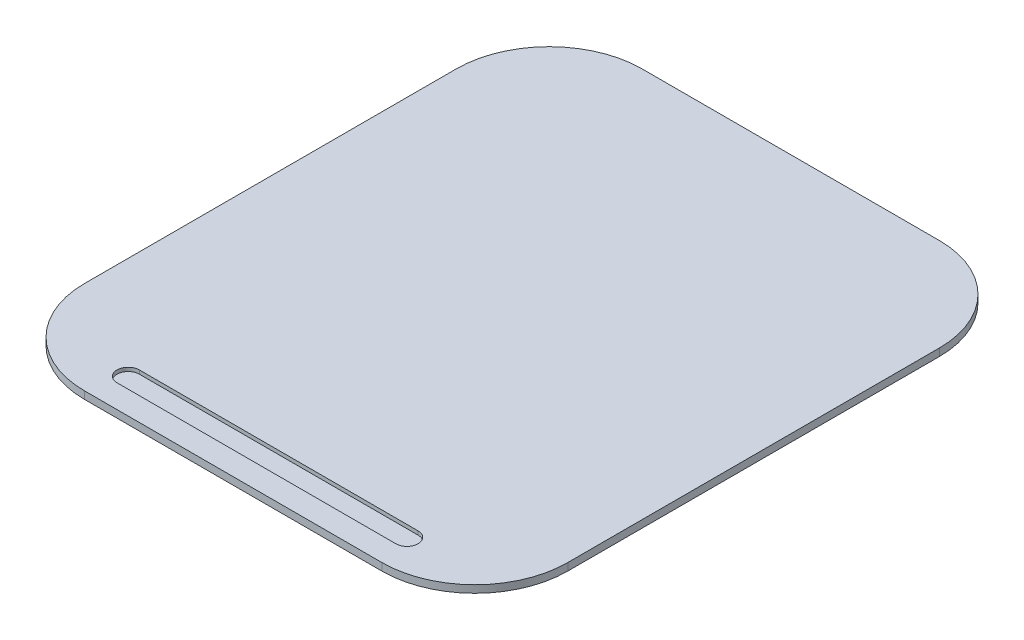
ISO-10303-21;
HEADER;
FILE_DESCRIPTION(('STEP AP214'),'2;1');
FILE_NAME('part.step','',(''),(''),'','','');
FILE_SCHEMA(('AUTOMOTIVE_DESIGN { 1 0 10303 214 1 1 1 1 }'));
ENDSEC;
DATA;
#1=APPLICATION_CONTEXT('core data for automotive mechanical design processes');
#2=APPLICATION_PROTOCOL_DEFINITION('international standard','automotive_design',2000,#1);
#3=PRODUCT_CONTEXT('',#1,'mechanical');
#4=PRODUCT('Part','Part','',(#3));
#5=PRODUCT_RELATED_PRODUCT_CATEGORY('part','',(#4));
#6=PRODUCT_DEFINITION_FORMATION('','',#4);
#7=PRODUCT_DEFINITION_CONTEXT('part definition',#1,'design');
#8=PRODUCT_DEFINITION('design','',#6,#7);
#9=PRODUCT_DEFINITION_SHAPE('','',#8);
#10=(LENGTH_UNIT() NAMED_UNIT(*) SI_UNIT(.MILLI.,.METRE.));
#11=(NAMED_UNIT(*) PLANE_ANGLE_UNIT() SI_UNIT($,.RADIAN.));
#12=(NAMED_UNIT(*) SI_UNIT($,.STERADIAN.) SOLID_ANGLE_UNIT());
#13=UNCERTAINTY_MEASURE_WITH_UNIT(LENGTH_MEASURE(1.E-05),#10,'distance_accuracy_value','');
#14=(GEOMETRIC_REPRESENTATION_CONTEXT(3) GLOBAL_UNCERTAINTY_ASSIGNED_CONTEXT((#13)) GLOBAL_UNIT_ASSIGNED_CONTEXT((#10,
#11,#12)) REPRESENTATION_CONTEXT('',''));
#15=CARTESIAN_POINT('',(0.,0.,0.));
#16=DIRECTION('',(0.,0.,1.));
#17=DIRECTION('',(1.,0.,0.));
#18=AXIS2_PLACEMENT_3D('',#15,#16,#17);
#19=CARTESIAN_POINT('',(160.,4.,-200.));
#20=DIRECTION('',(0.,-1.,0.));
#21=DIRECTION('',(0.,0.,-1.));
#22=AXIS2_PLACEMENT_3D('',#19,#20,#21);
#23=PLANE('',#22);
#24=CARTESIAN_POINT('',(160.,4.,-200.));
#25=DIRECTION('',(0.,1.,0.));
#26=DIRECTION('',(0.,0.,-1.));
#27=AXIS2_PLACEMENT_3D('',#24,#25,#26);
#28=CIRCLE('',#27,100.);
#29=CARTESIAN_POINT('',(260.,4.,-200.));
#30=VERTEX_POINT('',#29);
#31=CARTESIAN_POINT('',(160.,4.,-300.));
#32=VERTEX_POINT('',#31);
#33=EDGE_CURVE('E158',#30,#32,#28,.T.);
#34=ORIENTED_EDGE('',*,*,#33,.T.);
#35=DIRECTION('',(-1.,0.,0.));
#36=VECTOR('',#35,1.);
#37=CARTESIAN_POINT('',(-160.,4.,-300.));
#38=LINE('',#37,#36);
#39=CARTESIAN_POINT('',(-160.,4.,-300.));
#40=VERTEX_POINT('',#39);
#41=EDGE_CURVE('E98',#32,#40,#38,.T.);
#42=ORIENTED_EDGE('',*,*,#41,.T.);
#43=CARTESIAN_POINT('',(-160.,4.,-200.));
#44=DIRECTION('',(0.,1.,0.));
#45=DIRECTION('',(0.,0.,1.));
#46=AXIS2_PLACEMENT_3D('',#43,#44,#45);
#47=CIRCLE('',#46,100.);
#48=CARTESIAN_POINT('',(-260.,4.,-200.));
#49=VERTEX_POINT('',#48);
#50=EDGE_CURVE('E173',#40,#49,#47,.T.);
#51=ORIENTED_EDGE('',*,*,#50,.T.);
#52=DIRECTION('',(0.,0.,1.));
#53=VECTOR('',#52,1.);
#54=CARTESIAN_POINT('',(-260.,4.,-200.));
#55=LINE('',#54,#53);
#56=CARTESIAN_POINT('',(-260.,4.,200.));
#57=VERTEX_POINT('',#56);
#58=EDGE_CURVE('E185',#49,#57,#55,.T.);
#59=ORIENTED_EDGE('',*,*,#58,.T.);
#60=CARTESIAN_POINT('',(-160.,4.,200.));
#61=DIRECTION('',(0.,1.,0.));
#62=DIRECTION('',(0.,0.,1.));
#63=AXIS2_PLACEMENT_3D('',#60,#61,#62);
#64=CIRCLE('',#63,100.);
#65=CARTESIAN_POINT('',(-160.,4.,300.));
#66=VERTEX_POINT('',#65);
#67=EDGE_CURVE('E121',#57,#66,#64,.T.);
#68=ORIENTED_EDGE('',*,*,#67,.T.);
#69=DIRECTION('',(1.,0.,0.));
#70=VECTOR('',#69,1.);
#71=CARTESIAN_POINT('',(-160.,4.,300.));
#72=LINE('',#71,#70);
#73=CARTESIAN_POINT('',(160.,4.,300.));
#74=VERTEX_POINT('',#73);
#75=EDGE_CURVE('E114',#66,#74,#72,.T.);
#76=ORIENTED_EDGE('',*,*,#75,.T.);
#77=CARTESIAN_POINT('',(160.,4.,200.));
#78=DIRECTION('',(0.,1.,0.));
#79=DIRECTION('',(0.,0.,1.));
#80=AXIS2_PLACEMENT_3D('',#77,#78,#79);
#81=CIRCLE('',#80,100.);
#82=CARTESIAN_POINT('',(260.,4.,200.));
#83=VERTEX_POINT('',#82);
#84=EDGE_CURVE('E118',#74,#83,#81,.T.);
#85=ORIENTED_EDGE('',*,*,#84,.T.);
#86=DIRECTION('',(0.,0.,-1.));
#87=VECTOR('',#86,1.);
#88=CARTESIAN_POINT('',(260.,4.,-200.));
#89=LINE('',#88,#87);
#90=EDGE_CURVE('E57',#83,#30,#89,.T.);
#91=ORIENTED_EDGE('',*,*,#90,.T.);
#92=EDGE_LOOP('',(#34,#42,#51,#59,#68,#76,#85,#91));
#93=FACE_BOUND('',#92,.T.);
#94=CARTESIAN_POINT('',(-150.,4.,263.));
#95=DIRECTION('',(0.,1.,0.));
#96=DIRECTION('',(0.,0.,1.));
#97=AXIS2_PLACEMENT_3D('',#94,#95,#96);
#98=CIRCLE('',#97,12.);
#99=CARTESIAN_POINT('',(-150.,4.,251.));
#100=VERTEX_POINT('',#99);
#101=CARTESIAN_POINT('',(-150.,4.,275.));
#102=VERTEX_POINT('',#101);
#103=EDGE_CURVE('E204',#100,#102,#98,.T.);
#104=ORIENTED_EDGE('',*,*,#103,.F.);
#105=DIRECTION('',(-1.,0.,0.));
#106=VECTOR('',#105,1.);
#107=CARTESIAN_POINT('',(-150.,4.,251.));
#108=LINE('',#107,#106);
#109=CARTESIAN_POINT('',(150.,4.,251.));
#110=VERTEX_POINT('',#109);
#111=EDGE_CURVE('E200',#110,#100,#108,.T.);
#112=ORIENTED_EDGE('',*,*,#111,.F.);
#113=CARTESIAN_POINT('',(150.,4.,263.));
#114=DIRECTION('',(0.,1.,0.));
#115=DIRECTION('',(0.,0.,1.));
#116=AXIS2_PLACEMENT_3D('',#113,#114,#115);
#117=CIRCLE('',#116,12.);
#118=CARTESIAN_POINT('',(150.,4.,275.));
#119=VERTEX_POINT('',#118);
#120=EDGE_CURVE('E215',#119,#110,#117,.T.);
#121=ORIENTED_EDGE('',*,*,#120,.F.);
#122=DIRECTION('',(1.,0.,0.));
#123=VECTOR('',#122,1.);
#124=CARTESIAN_POINT('',(-150.,4.,275.));
#125=LINE('',#124,#123);
#126=EDGE_CURVE('E217',#102,#119,#125,.T.);
#127=ORIENTED_EDGE('',*,*,#126,.F.);
#128=EDGE_LOOP('',(#104,#112,#121,#127));
#129=FACE_BOUND('',#128,.T.);
#130=ADVANCED_FACE('F33',(#93,#129),#23,.F.);
#131=CARTESIAN_POINT('',(160.,4.,-200.));
#132=DIRECTION('',(0.,-1.,0.));
#133=DIRECTION('',(0.,0.,-1.));
#134=AXIS2_PLACEMENT_3D('',#131,#132,#133);
#135=CYLINDRICAL_SURFACE('',#134,100.);
#136=CARTESIAN_POINT('',(160.,-4.,-200.));
#137=DIRECTION('',(0.,1.,0.));
#138=DIRECTION('',(0.,0.,-1.));
#139=AXIS2_PLACEMENT_3D('',#136,#137,#138);
#140=CIRCLE('',#139,100.);
#141=CARTESIAN_POINT('',(260.,-4.,-200.));
#142=VERTEX_POINT('',#141);
#143=CARTESIAN_POINT('',(160.,-4.,-300.));
#144=VERTEX_POINT('',#143);
#145=EDGE_CURVE('E142',#142,#144,#140,.T.);
#146=ORIENTED_EDGE('',*,*,#145,.T.);
#147=DIRECTION('',(0.,-1.,0.));
#148=VECTOR('',#147,1.);
#149=CARTESIAN_POINT('',(160.,4.,-300.));
#150=LINE('',#149,#148);
#151=EDGE_CURVE('E11',#32,#144,#150,.T.);
#152=ORIENTED_EDGE('',*,*,#151,.F.);
#153=ORIENTED_EDGE('',*,*,#33,.F.);
#154=DIRECTION('',(0.,-1.,0.));
#155=VECTOR('',#154,1.);
#156=CARTESIAN_POINT('',(260.,4.,-200.));
#157=LINE('',#156,#155);
#158=EDGE_CURVE('E138',#30,#142,#157,.T.);
#159=ORIENTED_EDGE('',*,*,#158,.T.);
#160=EDGE_LOOP('',(#146,#152,#153,#159));
#161=FACE_BOUND('',#160,.T.);
#162=ADVANCED_FACE('F35',(#161),#135,.T.);
#163=CARTESIAN_POINT('',(-160.,4.,-300.));
#164=DIRECTION('',(0.,0.,1.));
#165=DIRECTION('',(1.,0.,0.));
#166=AXIS2_PLACEMENT_3D('',#163,#164,#165);
#167=PLANE('',#166);
#168=DIRECTION('',(-1.,0.,0.));
#169=VECTOR('',#168,1.);
#170=CARTESIAN_POINT('',(-160.,-4.,-300.));
#171=LINE('',#170,#169);
#172=CARTESIAN_POINT('',(-160.,-4.,-300.));
#173=VERTEX_POINT('',#172);
#174=EDGE_CURVE('E145',#144,#173,#171,.T.);
#175=ORIENTED_EDGE('',*,*,#174,.T.);
#176=DIRECTION('',(0.,-1.,0.));
#177=VECTOR('',#176,1.);
#178=CARTESIAN_POINT('',(-160.,4.,-300.));
#179=LINE('',#178,#177);
#180=EDGE_CURVE('E41',#40,#173,#179,.T.);
#181=ORIENTED_EDGE('',*,*,#180,.F.);
#182=ORIENTED_EDGE('',*,*,#41,.F.);
#183=ORIENTED_EDGE('',*,*,#151,.T.);
#184=EDGE_LOOP('',(#175,#181,#182,#183));
#185=FACE_BOUND('',#184,.T.);
#186=ADVANCED_FACE('F261',(#185),#167,.F.);
#187=CARTESIAN_POINT('',(-160.,4.,-200.));
#188=DIRECTION('',(0.,-1.,0.));
#189=DIRECTION('',(0.,0.,-1.));
#190=AXIS2_PLACEMENT_3D('',#187,#188,#189);
#191=CYLINDRICAL_SURFACE('',#190,100.);
#192=CARTESIAN_POINT('',(-160.,-4.,-200.));
#193=DIRECTION('',(0.,1.,0.));
#194=DIRECTION('',(0.,0.,1.));
#195=AXIS2_PLACEMENT_3D('',#192,#193,#194);
#196=CIRCLE('',#195,100.);
#197=CARTESIAN_POINT('',(-260.,-4.,-200.));
#198=VERTEX_POINT('',#197);
#199=EDGE_CURVE('E148',#173,#198,#196,.T.);
#200=ORIENTED_EDGE('',*,*,#199,.T.);
#201=DIRECTION('',(0.,-1.,0.));
#202=VECTOR('',#201,1.);
#203=CARTESIAN_POINT('',(-260.,4.,-200.));
#204=LINE('',#203,#202);
#205=EDGE_CURVE('E165',#49,#198,#204,.T.);
#206=ORIENTED_EDGE('',*,*,#205,.F.);
#207=ORIENTED_EDGE('',*,*,#50,.F.);
#208=ORIENTED_EDGE('',*,*,#180,.T.);
#209=EDGE_LOOP('',(#200,#206,#207,#208));
#210=FACE_BOUND('',#209,.T.);
#211=ADVANCED_FACE('F171',(#210),#191,.T.);
#212=CARTESIAN_POINT('',(-260.,4.,-200.));
#213=DIRECTION('',(1.,0.,0.));
#214=DIRECTION('',(0.,0.,-1.));
#215=AXIS2_PLACEMENT_3D('',#212,#213,#214);
#216=PLANE('',#215);
#217=DIRECTION('',(0.,0.,1.));
#218=VECTOR('',#217,1.);
#219=CARTESIAN_POINT('',(-260.,-4.,-200.));
#220=LINE('',#219,#218);
#221=CARTESIAN_POINT('',(-260.,-4.,200.));
#222=VERTEX_POINT('',#221);
#223=EDGE_CURVE('E150',#198,#222,#220,.T.);
#224=ORIENTED_EDGE('',*,*,#223,.T.);
#225=DIRECTION('',(0.,-1.,0.));
#226=VECTOR('',#225,1.);
#227=CARTESIAN_POINT('',(-260.,4.,200.));
#228=LINE('',#227,#226);
#229=EDGE_CURVE('E162',#57,#222,#228,.T.);
#230=ORIENTED_EDGE('',*,*,#229,.F.);
#231=ORIENTED_EDGE('',*,*,#58,.F.);
#232=ORIENTED_EDGE('',*,*,#205,.T.);
#233=EDGE_LOOP('',(#224,#230,#231,#232));
#234=FACE_BOUND('',#233,.T.);
#235=ADVANCED_FACE('F181',(#234),#216,.F.);
#236=CARTESIAN_POINT('',(-160.,4.,200.));
#237=DIRECTION('',(0.,-1.,0.));
#238=DIRECTION('',(0.,0.,-1.));
#239=AXIS2_PLACEMENT_3D('',#236,#237,#238);
#240=CYLINDRICAL_SURFACE('',#239,100.);
#241=CARTESIAN_POINT('',(-160.,-4.,200.));
#242=DIRECTION('',(0.,1.,0.));
#243=DIRECTION('',(0.,0.,1.));
#244=AXIS2_PLACEMENT_3D('',#241,#242,#243);
#245=CIRCLE('',#244,100.);
#246=CARTESIAN_POINT('',(-160.,-4.,300.));
#247=VERTEX_POINT('',#246);
#248=EDGE_CURVE('E152',#222,#247,#245,.T.);
#249=ORIENTED_EDGE('',*,*,#248,.T.);
#250=DIRECTION('',(0.,-1.,0.));
#251=VECTOR('',#250,1.);
#252=CARTESIAN_POINT('',(-160.,4.,300.));
#253=LINE('',#252,#251);
#254=EDGE_CURVE('E133',#66,#247,#253,.T.);
#255=ORIENTED_EDGE('',*,*,#254,.F.);
#256=ORIENTED_EDGE('',*,*,#67,.F.);
#257=ORIENTED_EDGE('',*,*,#229,.T.);
#258=EDGE_LOOP('',(#249,#255,#256,#257));
#259=FACE_BOUND('',#258,.T.);
#260=ADVANCED_FACE('F184',(#259),#240,.T.);
#261=CARTESIAN_POINT('',(-160.,4.,300.));
#262=DIRECTION('',(0.,0.,-1.));
#263=DIRECTION('',(-1.,0.,0.));
#264=AXIS2_PLACEMENT_3D('',#261,#262,#263);
#265=PLANE('',#264);
#266=DIRECTION('',(1.,0.,0.));
#267=VECTOR('',#266,1.);
#268=CARTESIAN_POINT('',(-160.,-4.,300.));
#269=LINE('',#268,#267);
#270=CARTESIAN_POINT('',(160.,-4.,300.));
#271=VERTEX_POINT('',#270);
#272=EDGE_CURVE('E130',#247,#271,#269,.T.);
#273=ORIENTED_EDGE('',*,*,#272,.T.);
#274=DIRECTION('',(0.,-1.,0.));
#275=VECTOR('',#274,1.);
#276=CARTESIAN_POINT('',(160.,4.,300.));
#277=LINE('',#276,#275);
#278=EDGE_CURVE('E127',#74,#271,#277,.T.);
#279=ORIENTED_EDGE('',*,*,#278,.F.);
#280=ORIENTED_EDGE('',*,*,#75,.F.);
#281=ORIENTED_EDGE('',*,*,#254,.T.);
#282=EDGE_LOOP('',(#273,#279,#280,#281));
#283=FACE_BOUND('',#282,.T.);
#284=ADVANCED_FACE('F128',(#283),#265,.F.);
#285=CARTESIAN_POINT('',(160.,4.,200.));
#286=DIRECTION('',(0.,-1.,0.));
#287=DIRECTION('',(0.,0.,-1.));
#288=AXIS2_PLACEMENT_3D('',#285,#286,#287);
#289=CYLINDRICAL_SURFACE('',#288,100.);
#290=CARTESIAN_POINT('',(160.,-4.,200.));
#291=DIRECTION('',(0.,1.,0.));
#292=DIRECTION('',(0.,0.,1.));
#293=AXIS2_PLACEMENT_3D('',#290,#291,#292);
#294=CIRCLE('',#293,100.);
#295=CARTESIAN_POINT('',(260.,-4.,200.));
#296=VERTEX_POINT('',#295);
#297=EDGE_CURVE('E155',#271,#296,#294,.T.);
#298=ORIENTED_EDGE('',*,*,#297,.T.);
#299=DIRECTION('',(0.,-1.,0.));
#300=VECTOR('',#299,1.);
#301=CARTESIAN_POINT('',(260.,4.,200.));
#302=LINE('',#301,#300);
#303=EDGE_CURVE('E134',#83,#296,#302,.T.);
#304=ORIENTED_EDGE('',*,*,#303,.F.);
#305=ORIENTED_EDGE('',*,*,#84,.F.);
#306=ORIENTED_EDGE('',*,*,#278,.T.);
#307=EDGE_LOOP('',(#298,#304,#305,#306));
#308=FACE_BOUND('',#307,.T.);
#309=ADVANCED_FACE('F136',(#308),#289,.T.);
#310=CARTESIAN_POINT('',(260.,4.,-200.));
#311=DIRECTION('',(-1.,0.,0.));
#312=DIRECTION('',(0.,0.,1.));
#313=AXIS2_PLACEMENT_3D('',#310,#311,#312);
#314=PLANE('',#313);
#315=DIRECTION('',(0.,0.,-1.));
#316=VECTOR('',#315,1.);
#317=CARTESIAN_POINT('',(260.,-4.,-200.));
#318=LINE('',#317,#316);
#319=EDGE_CURVE('E90',#296,#142,#318,.T.);
#320=ORIENTED_EDGE('',*,*,#319,.T.);
#321=ORIENTED_EDGE('',*,*,#158,.F.);
#322=ORIENTED_EDGE('',*,*,#90,.F.);
#323=ORIENTED_EDGE('',*,*,#303,.T.);
#324=EDGE_LOOP('',(#320,#321,#322,#323));
#325=FACE_BOUND('',#324,.T.);
#326=ADVANCED_FACE('F268',(#325),#314,.F.);
#327=CARTESIAN_POINT('',(160.,-4.,-200.));
#328=DIRECTION('',(0.,-1.,0.));
#329=DIRECTION('',(0.,0.,-1.));
#330=AXIS2_PLACEMENT_3D('',#327,#328,#329);
#331=PLANE('',#330);
#332=ORIENTED_EDGE('',*,*,#145,.F.);
#333=ORIENTED_EDGE('',*,*,#319,.F.);
#334=ORIENTED_EDGE('',*,*,#297,.F.);
#335=ORIENTED_EDGE('',*,*,#272,.F.);
#336=ORIENTED_EDGE('',*,*,#248,.F.);
#337=ORIENTED_EDGE('',*,*,#223,.F.);
#338=ORIENTED_EDGE('',*,*,#199,.F.);
#339=ORIENTED_EDGE('',*,*,#174,.F.);
#340=EDGE_LOOP('',(#332,#333,#334,#335,#336,#337,#338,#339));
#341=FACE_BOUND('',#340,.T.);
#342=ADVANCED_FACE('F177',(#341),#331,.T.);
#343=CARTESIAN_POINT('',(-150.,4.,263.));
#344=DIRECTION('',(0.,-1.,0.));
#345=DIRECTION('',(0.,0.,-1.));
#346=AXIS2_PLACEMENT_3D('',#343,#344,#345);
#347=CYLINDRICAL_SURFACE('',#346,12.);
#348=CARTESIAN_POINT('',(-150.,0.,263.));
#349=DIRECTION('',(0.,1.,0.));
#350=DIRECTION('',(0.,0.,1.));
#351=AXIS2_PLACEMENT_3D('',#348,#349,#350);
#352=CIRCLE('',#351,12.);
#353=CARTESIAN_POINT('',(-150.,0.,251.));
#354=VERTEX_POINT('',#353);
#355=CARTESIAN_POINT('',(-150.,0.,275.));
#356=VERTEX_POINT('',#355);
#357=EDGE_CURVE('E211',#354,#356,#352,.T.);
#358=ORIENTED_EDGE('',*,*,#357,.F.);
#359=DIRECTION('',(0.,-1.,0.));
#360=VECTOR('',#359,1.);
#361=CARTESIAN_POINT('',(-150.,4.,251.));
#362=LINE('',#361,#360);
#363=EDGE_CURVE('E197',#100,#354,#362,.T.);
#364=ORIENTED_EDGE('',*,*,#363,.F.);
#365=ORIENTED_EDGE('',*,*,#103,.T.);
#366=DIRECTION('',(0.,-1.,0.));
#367=VECTOR('',#366,1.);
#368=CARTESIAN_POINT('',(-150.,4.,275.));
#369=LINE('',#368,#367);
#370=EDGE_CURVE('E146',#102,#356,#369,.T.);
#371=ORIENTED_EDGE('',*,*,#370,.T.);
#372=EDGE_LOOP('',(#358,#364,#365,#371));
#373=FACE_BOUND('',#372,.T.);
#374=ADVANCED_FACE('F227',(#373),#347,.F.);
#375=CARTESIAN_POINT('',(-150.,4.,275.));
#376=DIRECTION('',(0.,0.,-1.));
#377=DIRECTION('',(-1.,0.,0.));
#378=AXIS2_PLACEMENT_3D('',#375,#376,#377);
#379=PLANE('',#378);
#380=DIRECTION('',(1.,0.,0.));
#381=VECTOR('',#380,1.);
#382=CARTESIAN_POINT('',(-150.,0.,275.));
#383=LINE('',#382,#381);
#384=CARTESIAN_POINT('',(150.,0.,275.));
#385=VERTEX_POINT('',#384);
#386=EDGE_CURVE('E208',#356,#385,#383,.T.);
#387=ORIENTED_EDGE('',*,*,#386,.F.);
#388=ORIENTED_EDGE('',*,*,#370,.F.);
#389=ORIENTED_EDGE('',*,*,#126,.T.);
#390=DIRECTION('',(0.,-1.,0.));
#391=VECTOR('',#390,1.);
#392=CARTESIAN_POINT('',(150.,4.,275.));
#393=LINE('',#392,#391);
#394=EDGE_CURVE('E193',#119,#385,#393,.T.);
#395=ORIENTED_EDGE('',*,*,#394,.T.);
#396=EDGE_LOOP('',(#387,#388,#389,#395));
#397=FACE_BOUND('',#396,.T.);
#398=ADVANCED_FACE('F235',(#397),#379,.T.);
#399=CARTESIAN_POINT('',(150.,4.,263.));
#400=DIRECTION('',(0.,-1.,0.));
#401=DIRECTION('',(0.,0.,-1.));
#402=AXIS2_PLACEMENT_3D('',#399,#400,#401);
#403=CYLINDRICAL_SURFACE('',#402,12.);
#404=CARTESIAN_POINT('',(150.,0.,263.));
#405=DIRECTION('',(0.,1.,0.));
#406=DIRECTION('',(0.,0.,1.));
#407=AXIS2_PLACEMENT_3D('',#404,#405,#406);
#408=CIRCLE('',#407,12.);
#409=CARTESIAN_POINT('',(150.,0.,251.));
#410=VERTEX_POINT('',#409);
#411=EDGE_CURVE('E205',#385,#410,#408,.T.);
#412=ORIENTED_EDGE('',*,*,#411,.F.);
#413=ORIENTED_EDGE('',*,*,#394,.F.);
#414=ORIENTED_EDGE('',*,*,#120,.T.);
#415=DIRECTION('',(0.,-1.,0.));
#416=VECTOR('',#415,1.);
#417=CARTESIAN_POINT('',(150.,4.,251.));
#418=LINE('',#417,#416);
#419=EDGE_CURVE('E48',#110,#410,#418,.T.);
#420=ORIENTED_EDGE('',*,*,#419,.T.);
#421=EDGE_LOOP('',(#412,#413,#414,#420));
#422=FACE_BOUND('',#421,.T.);
#423=ADVANCED_FACE('F241',(#422),#403,.F.);
#424=CARTESIAN_POINT('',(-150.,4.,251.));
#425=DIRECTION('',(0.,0.,1.));
#426=DIRECTION('',(1.,0.,0.));
#427=AXIS2_PLACEMENT_3D('',#424,#425,#426);
#428=PLANE('',#427);
#429=DIRECTION('',(-1.,0.,0.));
#430=VECTOR('',#429,1.);
#431=CARTESIAN_POINT('',(-150.,0.,251.));
#432=LINE('',#431,#430);
#433=EDGE_CURVE('E201',#410,#354,#432,.T.);
#434=ORIENTED_EDGE('',*,*,#433,.F.);
#435=ORIENTED_EDGE('',*,*,#419,.F.);
#436=ORIENTED_EDGE('',*,*,#111,.T.);
#437=ORIENTED_EDGE('',*,*,#363,.T.);
#438=EDGE_LOOP('',(#434,#435,#436,#437));
#439=FACE_BOUND('',#438,.T.);
#440=ADVANCED_FACE('F248',(#439),#428,.T.);
#441=CARTESIAN_POINT('',(-150.,0.,263.));
#442=DIRECTION('',(0.,1.,0.));
#443=DIRECTION('',(0.,0.,1.));
#444=AXIS2_PLACEMENT_3D('',#441,#442,#443);
#445=PLANE('',#444);
#446=ORIENTED_EDGE('',*,*,#357,.T.);
#447=ORIENTED_EDGE('',*,*,#386,.T.);
#448=ORIENTED_EDGE('',*,*,#411,.T.);
#449=ORIENTED_EDGE('',*,*,#433,.T.);
#450=EDGE_LOOP('',(#446,#447,#448,#449));
#451=FACE_BOUND('',#450,.T.);
#452=ADVANCED_FACE('F249',(#451),#445,.T.);
#453=CLOSED_SHELL('',(#130,#162,#186,#211,#235,#260,#284,#309,#326,#342,#374,#398,#423,#440,#452));
#454=MANIFOLD_SOLID_BREP('B2',#453);
#455=ADVANCED_BREP_SHAPE_REPRESENTATION('',(#18,#454),#14);
#456=SHAPE_DEFINITION_REPRESENTATION(#9,#455);
ENDSEC;
END-ISO-10303-21;
